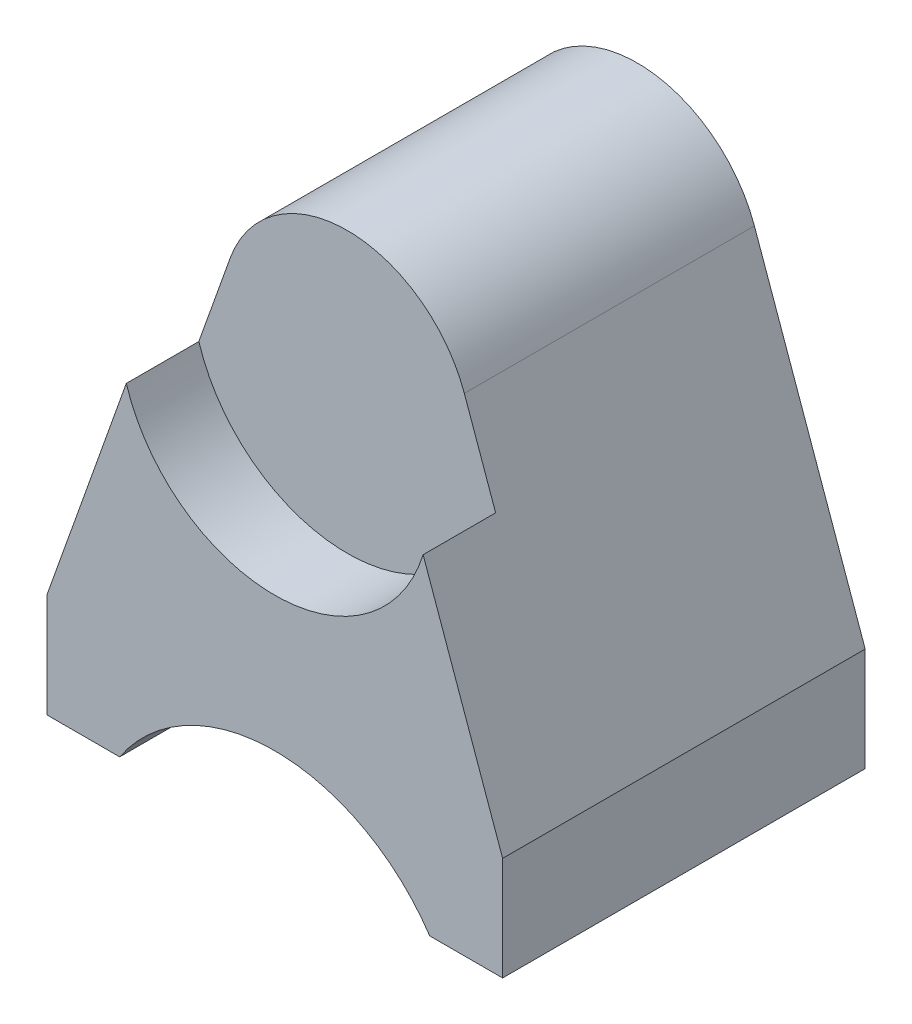
ISO-10303-21;
HEADER;
FILE_DESCRIPTION(('STEP AP214'),'2;1');
FILE_NAME('part.step','',(''),(''),'','','');
FILE_SCHEMA(('AUTOMOTIVE_DESIGN { 1 0 10303 214 1 1 1 1 }'));
ENDSEC;
DATA;
#1=APPLICATION_CONTEXT('core data for automotive mechanical design processes');
#2=APPLICATION_PROTOCOL_DEFINITION('international standard','automotive_design',2000,#1);
#3=PRODUCT_CONTEXT('',#1,'mechanical');
#4=PRODUCT('Part','Part','',(#3));
#5=PRODUCT_RELATED_PRODUCT_CATEGORY('part','',(#4));
#6=PRODUCT_DEFINITION_FORMATION('','',#4);
#7=PRODUCT_DEFINITION_CONTEXT('part definition',#1,'design');
#8=PRODUCT_DEFINITION('design','',#6,#7);
#9=PRODUCT_DEFINITION_SHAPE('','',#8);
#10=(LENGTH_UNIT() NAMED_UNIT(*) SI_UNIT(.MILLI.,.METRE.));
#11=(NAMED_UNIT(*) PLANE_ANGLE_UNIT() SI_UNIT($,.RADIAN.));
#12=(NAMED_UNIT(*) SI_UNIT($,.STERADIAN.) SOLID_ANGLE_UNIT());
#13=UNCERTAINTY_MEASURE_WITH_UNIT(LENGTH_MEASURE(1.E-05),#10,'distance_accuracy_value','');
#14=(GEOMETRIC_REPRESENTATION_CONTEXT(3) GLOBAL_UNCERTAINTY_ASSIGNED_CONTEXT((#13)) GLOBAL_UNIT_ASSIGNED_CONTEXT((#10,
#11,#12)) REPRESENTATION_CONTEXT('',''));
#15=CARTESIAN_POINT('',(0.,0.,0.));
#16=DIRECTION('',(0.,0.,1.));
#17=DIRECTION('',(1.,0.,0.));
#18=AXIS2_PLACEMENT_3D('',#15,#16,#17);
#19=CARTESIAN_POINT('',(0.,36.,-17.5));
#20=DIRECTION('',(0.,0.,1.));
#21=DIRECTION('',(1.,0.,0.));
#22=AXIS2_PLACEMENT_3D('',#19,#20,#21);
#23=CYLINDRICAL_SURFACE('',#22,12.);
#24=DIRECTION('',(0.,0.,1.));
#25=VECTOR('',#24,1.);
#26=CARTESIAN_POINT('',(-11.3042444216532,40.0266683567835,-17.5));
#27=LINE('',#26,#25);
#28=CARTESIAN_POINT('',(-11.3042444216532,40.0266683567835,-17.5));
#29=VERTEX_POINT('',#28);
#30=CARTESIAN_POINT('',(-11.3042444216532,40.0266683567835,10.5));
#31=VERTEX_POINT('',#30);
#32=EDGE_CURVE('E125',#29,#31,#27,.T.);
#33=ORIENTED_EDGE('',*,*,#32,.T.);
#34=CARTESIAN_POINT('',(0.,36.,10.5));
#35=DIRECTION('',(0.,0.,1.));
#36=DIRECTION('',(1.,0.,0.));
#37=AXIS2_PLACEMENT_3D('',#34,#35,#36);
#38=CIRCLE('',#37,12.);
#39=CARTESIAN_POINT('',(11.3042444216532,40.0266683567835,10.5));
#40=VERTEX_POINT('',#39);
#41=EDGE_CURVE('E122',#31,#40,#38,.F.);
#42=ORIENTED_EDGE('',*,*,#41,.T.);
#43=DIRECTION('',(0.,0.,1.));
#44=VECTOR('',#43,1.);
#45=CARTESIAN_POINT('',(11.3042444216532,40.0266683567835,-17.5));
#46=LINE('',#45,#44);
#47=CARTESIAN_POINT('',(11.3042444216532,40.0266683567835,-17.5));
#48=VERTEX_POINT('',#47);
#49=EDGE_CURVE('E115',#48,#40,#46,.T.);
#50=ORIENTED_EDGE('',*,*,#49,.F.);
#51=CARTESIAN_POINT('',(0.,36.,-17.5));
#52=DIRECTION('',(0.,0.,1.));
#53=DIRECTION('',(1.,0.,0.));
#54=AXIS2_PLACEMENT_3D('',#51,#52,#53);
#55=CIRCLE('',#54,12.);
#56=EDGE_CURVE('E118',#48,#29,#55,.T.);
#57=ORIENTED_EDGE('',*,*,#56,.T.);
#58=EDGE_LOOP('',(#33,#42,#50,#57));
#59=FACE_BOUND('',#58,.T.);
#60=ADVANCED_FACE('F37',(#59),#23,.T.);
#61=CARTESIAN_POINT('',(-22.,0.,-17.5));
#62=DIRECTION('',(-1.,0.,0.));
#63=DIRECTION('',(0.,-1.,0.));
#64=AXIS2_PLACEMENT_3D('',#61,#62,#63);
#65=PLANE('',#64);
#66=DIRECTION('',(0.,-1.,0.));
#67=VECTOR('',#66,1.);
#68=CARTESIAN_POINT('',(-22.,0.,17.5));
#69=LINE('',#68,#67);
#70=CARTESIAN_POINT('',(-22.,10.,17.5));
#71=VERTEX_POINT('',#70);
#72=CARTESIAN_POINT('',(-22.,0.,17.5));
#73=VERTEX_POINT('',#72);
#74=EDGE_CURVE('E147',#71,#73,#69,.T.);
#75=ORIENTED_EDGE('',*,*,#74,.F.);
#76=DIRECTION('',(0.,0.,1.));
#77=VECTOR('',#76,1.);
#78=CARTESIAN_POINT('',(-22.,10.,-17.5));
#79=LINE('',#78,#77);
#80=CARTESIAN_POINT('',(-22.,10.,-17.5));
#81=VERTEX_POINT('',#80);
#82=EDGE_CURVE('E45',#81,#71,#79,.T.);
#83=ORIENTED_EDGE('',*,*,#82,.F.);
#84=DIRECTION('',(0.,-1.,0.));
#85=VECTOR('',#84,1.);
#86=CARTESIAN_POINT('',(-22.,0.,-17.5));
#87=LINE('',#86,#85);
#88=CARTESIAN_POINT('',(-22.,0.,-17.5));
#89=VERTEX_POINT('',#88);
#90=EDGE_CURVE('E166',#81,#89,#87,.T.);
#91=ORIENTED_EDGE('',*,*,#90,.T.);
#92=DIRECTION('',(0.,0.,1.));
#93=VECTOR('',#92,1.);
#94=CARTESIAN_POINT('',(-22.,0.,-17.5));
#95=LINE('',#94,#93);
#96=EDGE_CURVE('E95',#89,#73,#95,.T.);
#97=ORIENTED_EDGE('',*,*,#96,.T.);
#98=EDGE_LOOP('',(#75,#83,#91,#97));
#99=FACE_BOUND('',#98,.T.);
#100=ADVANCED_FACE('F39',(#99),#65,.T.);
#101=CARTESIAN_POINT('',(-22.,10.,-17.5));
#102=DIRECTION('',(-0.942020368471103,0.335555696398626,0.));
#103=DIRECTION('',(-0.335555696398626,-0.942020368471103,0.));
#104=AXIS2_PLACEMENT_3D('',#101,#102,#103);
#105=PLANE('',#104);
#106=DIRECTION('',(0.,0.,1.));
#107=VECTOR('',#106,1.);
#108=CARTESIAN_POINT('',(-14.3242456892409,31.5484850405436,10.5));
#109=LINE('',#108,#107);
#110=CARTESIAN_POINT('',(-14.3242456892409,31.5484850405436,10.5));
#111=VERTEX_POINT('',#110);
#112=CARTESIAN_POINT('',(-14.3242456892409,31.5484850405436,17.5));
#113=VERTEX_POINT('',#112);
#114=EDGE_CURVE('E52',#111,#113,#109,.T.);
#115=ORIENTED_EDGE('',*,*,#114,.F.);
#116=DIRECTION('',(0.335555696398626,0.942020368471103,0.));
#117=VECTOR('',#116,1.);
#118=CARTESIAN_POINT('',(-22.,10.,10.5));
#119=LINE('',#118,#117);
#120=EDGE_CURVE('E150',#111,#31,#119,.T.);
#121=ORIENTED_EDGE('',*,*,#120,.T.);
#122=ORIENTED_EDGE('',*,*,#32,.F.);
#123=DIRECTION('',(-0.335555696398626,-0.942020368471103,0.));
#124=VECTOR('',#123,1.);
#125=CARTESIAN_POINT('',(-22.,10.,-17.5));
#126=LINE('',#125,#124);
#127=EDGE_CURVE('E135',#29,#81,#126,.T.);
#128=ORIENTED_EDGE('',*,*,#127,.T.);
#129=ORIENTED_EDGE('',*,*,#82,.T.);
#130=DIRECTION('',(-0.335555696398626,-0.942020368471103,0.));
#131=VECTOR('',#130,1.);
#132=CARTESIAN_POINT('',(-22.,10.,17.5));
#133=LINE('',#132,#131);
#134=EDGE_CURVE('E88',#113,#71,#133,.T.);
#135=ORIENTED_EDGE('',*,*,#134,.F.);
#136=EDGE_LOOP('',(#115,#121,#122,#128,#129,#135));
#137=FACE_BOUND('',#136,.T.);
#138=ADVANCED_FACE('F195',(#137),#105,.T.);
#139=CARTESIAN_POINT('',(22.,10.,-17.5));
#140=DIRECTION('',(0.942020368471103,0.335555696398626,0.));
#141=DIRECTION('',(-0.335555696398626,0.942020368471103,0.));
#142=AXIS2_PLACEMENT_3D('',#139,#140,#141);
#143=PLANE('',#142);
#144=DIRECTION('',(0.,0.,1.));
#145=VECTOR('',#144,1.);
#146=CARTESIAN_POINT('',(14.3242456892409,31.5484850405436,10.5));
#147=LINE('',#146,#145);
#148=CARTESIAN_POINT('',(14.3242456892409,31.5484850405436,17.5));
#149=VERTEX_POINT('',#148);
#150=CARTESIAN_POINT('',(14.3242456892409,31.5484850405436,10.5));
#151=VERTEX_POINT('',#150);
#152=EDGE_CURVE('E272',#149,#151,#147,.F.);
#153=ORIENTED_EDGE('',*,*,#152,.F.);
#154=DIRECTION('',(-0.335555696398626,0.942020368471103,0.));
#155=VECTOR('',#154,1.);
#156=CARTESIAN_POINT('',(22.,10.,17.5));
#157=LINE('',#156,#155);
#158=CARTESIAN_POINT('',(22.,10.,17.5));
#159=VERTEX_POINT('',#158);
#160=EDGE_CURVE('E162',#159,#149,#157,.T.);
#161=ORIENTED_EDGE('',*,*,#160,.F.);
#162=DIRECTION('',(0.,0.,1.));
#163=VECTOR('',#162,1.);
#164=CARTESIAN_POINT('',(22.,10.,-17.5));
#165=LINE('',#164,#163);
#166=CARTESIAN_POINT('',(22.,10.,-17.5));
#167=VERTEX_POINT('',#166);
#168=EDGE_CURVE('E126',#167,#159,#165,.T.);
#169=ORIENTED_EDGE('',*,*,#168,.F.);
#170=DIRECTION('',(-0.335555696398626,0.942020368471103,0.));
#171=VECTOR('',#170,1.);
#172=CARTESIAN_POINT('',(22.,10.,-17.5));
#173=LINE('',#172,#171);
#174=EDGE_CURVE('E132',#167,#48,#173,.T.);
#175=ORIENTED_EDGE('',*,*,#174,.T.);
#176=ORIENTED_EDGE('',*,*,#49,.T.);
#177=DIRECTION('',(0.335555696398626,-0.942020368471103,0.));
#178=VECTOR('',#177,1.);
#179=CARTESIAN_POINT('',(22.,10.,10.5));
#180=LINE('',#179,#178);
#181=EDGE_CURVE('E11',#40,#151,#180,.T.);
#182=ORIENTED_EDGE('',*,*,#181,.T.);
#183=EDGE_LOOP('',(#153,#161,#169,#175,#176,#182));
#184=FACE_BOUND('',#183,.T.);
#185=ADVANCED_FACE('F138',(#184),#143,.T.);
#186=CARTESIAN_POINT('',(22.,0.,-17.5));
#187=DIRECTION('',(1.,0.,0.));
#188=DIRECTION('',(0.,0.,-1.));
#189=AXIS2_PLACEMENT_3D('',#186,#187,#188);
#190=PLANE('',#189);
#191=DIRECTION('',(0.,1.,0.));
#192=VECTOR('',#191,1.);
#193=CARTESIAN_POINT('',(22.,0.,17.5));
#194=LINE('',#193,#192);
#195=CARTESIAN_POINT('',(22.,0.,17.5));
#196=VERTEX_POINT('',#195);
#197=EDGE_CURVE('E159',#196,#159,#194,.T.);
#198=ORIENTED_EDGE('',*,*,#197,.F.);
#199=DIRECTION('',(0.,0.,1.));
#200=VECTOR('',#199,1.);
#201=CARTESIAN_POINT('',(22.,0.,-17.5));
#202=LINE('',#201,#200);
#203=CARTESIAN_POINT('',(22.,0.,-17.5));
#204=VERTEX_POINT('',#203);
#205=EDGE_CURVE('E170',#204,#196,#202,.T.);
#206=ORIENTED_EDGE('',*,*,#205,.F.);
#207=DIRECTION('',(0.,1.,0.));
#208=VECTOR('',#207,1.);
#209=CARTESIAN_POINT('',(22.,0.,-17.5));
#210=LINE('',#209,#208);
#211=EDGE_CURVE('E140',#204,#167,#210,.T.);
#212=ORIENTED_EDGE('',*,*,#211,.T.);
#213=ORIENTED_EDGE('',*,*,#168,.T.);
#214=EDGE_LOOP('',(#198,#206,#212,#213));
#215=FACE_BOUND('',#214,.T.);
#216=ADVANCED_FACE('F199',(#215),#190,.T.);
#217=CARTESIAN_POINT('',(14.9666295470958,0.,-17.5));
#218=DIRECTION('',(0.,-1.,0.));
#219=DIRECTION('',(1.,0.,0.));
#220=AXIS2_PLACEMENT_3D('',#217,#218,#219);
#221=PLANE('',#220);
#222=DIRECTION('',(1.,0.,0.));
#223=VECTOR('',#222,1.);
#224=CARTESIAN_POINT('',(14.9666295470958,0.,17.5));
#225=LINE('',#224,#223);
#226=CARTESIAN_POINT('',(14.9666295470958,0.,17.5));
#227=VERTEX_POINT('',#226);
#228=EDGE_CURVE('E156',#227,#196,#225,.T.);
#229=ORIENTED_EDGE('',*,*,#228,.F.);
#230=DIRECTION('',(0.,0.,1.));
#231=VECTOR('',#230,1.);
#232=CARTESIAN_POINT('',(14.9666295470958,0.,-17.5));
#233=LINE('',#232,#231);
#234=CARTESIAN_POINT('',(14.9666295470958,0.,-17.5));
#235=VERTEX_POINT('',#234);
#236=EDGE_CURVE('E172',#235,#227,#233,.T.);
#237=ORIENTED_EDGE('',*,*,#236,.F.);
#238=DIRECTION('',(1.,0.,0.));
#239=VECTOR('',#238,1.);
#240=CARTESIAN_POINT('',(14.9666295470958,0.,-17.5));
#241=LINE('',#240,#239);
#242=EDGE_CURVE('E142',#235,#204,#241,.T.);
#243=ORIENTED_EDGE('',*,*,#242,.T.);
#244=ORIENTED_EDGE('',*,*,#205,.T.);
#245=EDGE_LOOP('',(#229,#237,#243,#244));
#246=FACE_BOUND('',#245,.T.);
#247=ADVANCED_FACE('F202',(#246),#221,.T.);
#248=CARTESIAN_POINT('',(0.,-10.,-17.5));
#249=DIRECTION('',(0.,0.,1.));
#250=DIRECTION('',(1.,0.,0.));
#251=AXIS2_PLACEMENT_3D('',#248,#249,#250);
#252=CYLINDRICAL_SURFACE('',#251,18.);
#253=CARTESIAN_POINT('',(0.,-10.,17.5));
#254=DIRECTION('',(0.,0.,-1.));
#255=DIRECTION('',(-1.,0.,0.));
#256=AXIS2_PLACEMENT_3D('',#253,#254,#255);
#257=CIRCLE('',#256,18.);
#258=CARTESIAN_POINT('',(-14.9666295470958,0.,17.5));
#259=VERTEX_POINT('',#258);
#260=EDGE_CURVE('E153',#259,#227,#257,.T.);
#261=ORIENTED_EDGE('',*,*,#260,.F.);
#262=DIRECTION('',(0.,0.,1.));
#263=VECTOR('',#262,1.);
#264=CARTESIAN_POINT('',(-14.9666295470958,0.,-17.5));
#265=LINE('',#264,#263);
#266=CARTESIAN_POINT('',(-14.9666295470958,0.,-17.5));
#267=VERTEX_POINT('',#266);
#268=EDGE_CURVE('E174',#267,#259,#265,.T.);
#269=ORIENTED_EDGE('',*,*,#268,.F.);
#270=CARTESIAN_POINT('',(0.,-10.,-17.5));
#271=DIRECTION('',(0.,0.,-1.));
#272=DIRECTION('',(-1.,0.,0.));
#273=AXIS2_PLACEMENT_3D('',#270,#271,#272);
#274=CIRCLE('',#273,18.);
#275=EDGE_CURVE('E282',#267,#235,#274,.T.);
#276=ORIENTED_EDGE('',*,*,#275,.T.);
#277=ORIENTED_EDGE('',*,*,#236,.T.);
#278=EDGE_LOOP('',(#261,#269,#276,#277));
#279=FACE_BOUND('',#278,.T.);
#280=ADVANCED_FACE('F206',(#279),#252,.F.);
#281=CARTESIAN_POINT('',(-14.9666295470958,0.,-17.5));
#282=DIRECTION('',(0.,-1.,0.));
#283=DIRECTION('',(1.,0.,0.));
#284=AXIS2_PLACEMENT_3D('',#281,#282,#283);
#285=PLANE('',#284);
#286=DIRECTION('',(1.,0.,0.));
#287=VECTOR('',#286,1.);
#288=CARTESIAN_POINT('',(-14.9666295470958,0.,17.5));
#289=LINE('',#288,#287);
#290=EDGE_CURVE('E149',#73,#259,#289,.T.);
#291=ORIENTED_EDGE('',*,*,#290,.F.);
#292=ORIENTED_EDGE('',*,*,#96,.F.);
#293=DIRECTION('',(1.,0.,0.));
#294=VECTOR('',#293,1.);
#295=CARTESIAN_POINT('',(-14.9666295470958,0.,-17.5));
#296=LINE('',#295,#294);
#297=EDGE_CURVE('E283',#89,#267,#296,.T.);
#298=ORIENTED_EDGE('',*,*,#297,.T.);
#299=ORIENTED_EDGE('',*,*,#268,.T.);
#300=EDGE_LOOP('',(#291,#292,#298,#299));
#301=FACE_BOUND('',#300,.T.);
#302=ADVANCED_FACE('F175',(#301),#285,.T.);
#303=CARTESIAN_POINT('',(0.,36.,-17.5));
#304=DIRECTION('',(0.,0.,1.));
#305=DIRECTION('',(1.,0.,0.));
#306=AXIS2_PLACEMENT_3D('',#303,#304,#305);
#307=PLANE('',#306);
#308=ORIENTED_EDGE('',*,*,#90,.F.);
#309=ORIENTED_EDGE('',*,*,#127,.F.);
#310=ORIENTED_EDGE('',*,*,#56,.F.);
#311=ORIENTED_EDGE('',*,*,#174,.F.);
#312=ORIENTED_EDGE('',*,*,#211,.F.);
#313=ORIENTED_EDGE('',*,*,#242,.F.);
#314=ORIENTED_EDGE('',*,*,#275,.F.);
#315=ORIENTED_EDGE('',*,*,#297,.F.);
#316=EDGE_LOOP('',(#308,#309,#310,#311,#312,#313,#314,#315));
#317=FACE_BOUND('',#316,.T.);
#318=ADVANCED_FACE('F130',(#317),#307,.F.);
#319=CARTESIAN_POINT('',(0.,36.,17.5));
#320=DIRECTION('',(0.,0.,1.));
#321=DIRECTION('',(1.,0.,0.));
#322=AXIS2_PLACEMENT_3D('',#319,#320,#321);
#323=PLANE('',#322);
#324=CARTESIAN_POINT('',(0.,36.,17.5));
#325=DIRECTION('',(0.,0.,1.));
#326=DIRECTION('',(1.,0.,0.));
#327=AXIS2_PLACEMENT_3D('',#324,#325,#326);
#328=CIRCLE('',#327,15.);
#329=EDGE_CURVE('E178',#113,#149,#328,.T.);
#330=ORIENTED_EDGE('',*,*,#329,.F.);
#331=ORIENTED_EDGE('',*,*,#134,.T.);
#332=ORIENTED_EDGE('',*,*,#74,.T.);
#333=ORIENTED_EDGE('',*,*,#290,.T.);
#334=ORIENTED_EDGE('',*,*,#260,.T.);
#335=ORIENTED_EDGE('',*,*,#228,.T.);
#336=ORIENTED_EDGE('',*,*,#197,.T.);
#337=ORIENTED_EDGE('',*,*,#160,.T.);
#338=EDGE_LOOP('',(#330,#331,#332,#333,#334,#335,#336,#337));
#339=FACE_BOUND('',#338,.T.);
#340=ADVANCED_FACE('F177',(#339),#323,.T.);
#341=CARTESIAN_POINT('',(0.,36.,10.5));
#342=DIRECTION('',(0.,0.,1.));
#343=DIRECTION('',(1.,0.,0.));
#344=AXIS2_PLACEMENT_3D('',#341,#342,#343);
#345=CYLINDRICAL_SURFACE('',#344,15.);
#346=ORIENTED_EDGE('',*,*,#114,.T.);
#347=ORIENTED_EDGE('',*,*,#329,.T.);
#348=ORIENTED_EDGE('',*,*,#152,.T.);
#349=CARTESIAN_POINT('',(0.,36.,10.5));
#350=DIRECTION('',(0.,0.,1.));
#351=DIRECTION('',(1.,0.,0.));
#352=AXIS2_PLACEMENT_3D('',#349,#350,#351);
#353=CIRCLE('',#352,15.);
#354=EDGE_CURVE('E266',#111,#151,#353,.T.);
#355=ORIENTED_EDGE('',*,*,#354,.F.);
#356=EDGE_LOOP('',(#346,#347,#348,#355));
#357=FACE_BOUND('',#356,.T.);
#358=ADVANCED_FACE('F180',(#357),#345,.F.);
#359=CARTESIAN_POINT('',(0.,36.,10.5));
#360=DIRECTION('',(0.,0.,1.));
#361=DIRECTION('',(1.,0.,0.));
#362=AXIS2_PLACEMENT_3D('',#359,#360,#361);
#363=PLANE('',#362);
#364=ORIENTED_EDGE('',*,*,#354,.T.);
#365=ORIENTED_EDGE('',*,*,#181,.F.);
#366=ORIENTED_EDGE('',*,*,#41,.F.);
#367=ORIENTED_EDGE('',*,*,#120,.F.);
#368=EDGE_LOOP('',(#364,#365,#366,#367));
#369=FACE_BOUND('',#368,.T.);
#370=ADVANCED_FACE('F186',(#369),#363,.T.);
#371=CLOSED_SHELL('',(#60,#100,#138,#185,#216,#247,#280,#302,#318,#340,#358,#370));
#372=MANIFOLD_SOLID_BREP('B2',#371);
#373=ADVANCED_BREP_SHAPE_REPRESENTATION('',(#18,#372),#14);
#374=SHAPE_DEFINITION_REPRESENTATION(#9,#373);
ENDSEC;
END-ISO-10303-21;
